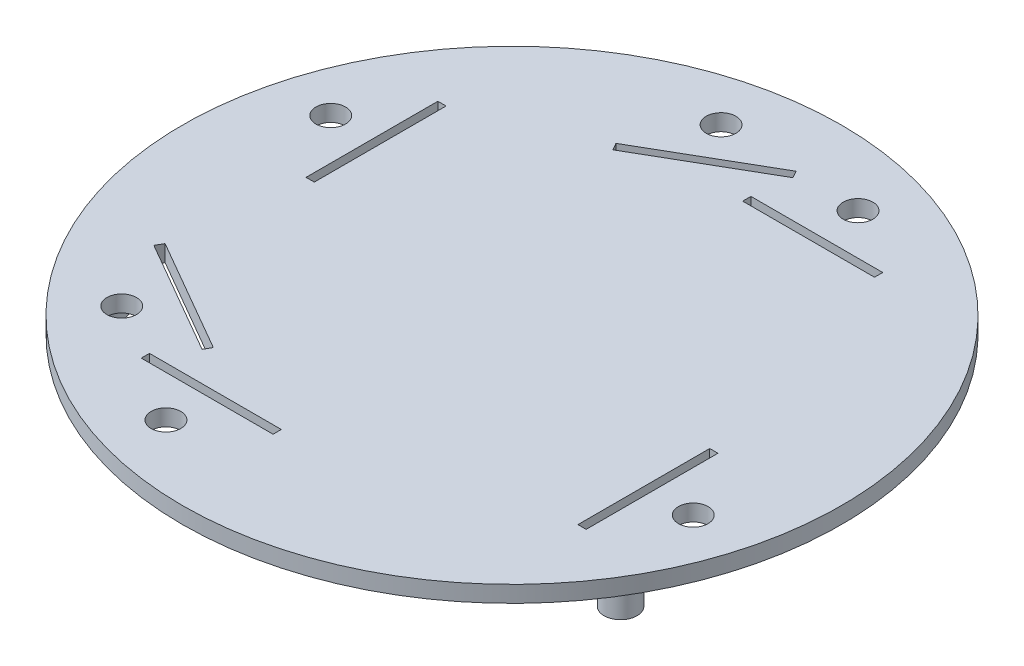
ISO-10303-21;
HEADER;
FILE_DESCRIPTION(('STEP AP214'),'2;1');
FILE_NAME('part.step','',(''),(''),'','','');
FILE_SCHEMA(('AUTOMOTIVE_DESIGN { 1 0 10303 214 1 1 1 1 }'));
ENDSEC;
DATA;
#1=APPLICATION_CONTEXT('core data for automotive mechanical design processes');
#2=APPLICATION_PROTOCOL_DEFINITION('international standard','automotive_design',2000,#1);
#3=PRODUCT_CONTEXT('',#1,'mechanical');
#4=PRODUCT('Part','Part','',(#3));
#5=PRODUCT_RELATED_PRODUCT_CATEGORY('part','',(#4));
#6=PRODUCT_DEFINITION_FORMATION('','',#4);
#7=PRODUCT_DEFINITION_CONTEXT('part definition',#1,'design');
#8=PRODUCT_DEFINITION('design','',#6,#7);
#9=PRODUCT_DEFINITION_SHAPE('','',#8);
#10=(LENGTH_UNIT() NAMED_UNIT(*) SI_UNIT(.MILLI.,.METRE.));
#11=(NAMED_UNIT(*) PLANE_ANGLE_UNIT() SI_UNIT($,.RADIAN.));
#12=(NAMED_UNIT(*) SI_UNIT($,.STERADIAN.) SOLID_ANGLE_UNIT());
#13=UNCERTAINTY_MEASURE_WITH_UNIT(LENGTH_MEASURE(1.E-05),#10,'distance_accuracy_value','');
#14=(GEOMETRIC_REPRESENTATION_CONTEXT(3) GLOBAL_UNCERTAINTY_ASSIGNED_CONTEXT((#13)) GLOBAL_UNIT_ASSIGNED_CONTEXT((#10,
#11,#12)) REPRESENTATION_CONTEXT('',''));
#15=CARTESIAN_POINT('',(0.,0.,0.));
#16=DIRECTION('',(0.,0.,1.));
#17=DIRECTION('',(1.,0.,0.));
#18=AXIS2_PLACEMENT_3D('',#15,#16,#17);
#19=CARTESIAN_POINT('',(0.,6.35,0.));
#20=DIRECTION('',(0.,-1.,0.));
#21=DIRECTION('',(0.,0.,-1.));
#22=AXIS2_PLACEMENT_3D('',#19,#20,#21);
#23=CYLINDRICAL_SURFACE('',#22,127.);
#24=CARTESIAN_POINT('',(0.,6.35,0.));
#25=DIRECTION('',(0.,1.,0.));
#26=DIRECTION('',(0.,0.,1.));
#27=AXIS2_PLACEMENT_3D('',#24,#25,#26);
#28=CIRCLE('',#27,127.);
#29=CARTESIAN_POINT('',(0.,6.35,127.));
#30=VERTEX_POINT('',#29);
#31=EDGE_CURVE('E349',#30,#30,#28,.T.);
#32=ORIENTED_EDGE('',*,*,#31,.F.);
#33=EDGE_LOOP('',(#32));
#34=FACE_BOUND('',#33,.T.);
#35=CARTESIAN_POINT('',(0.,0.,0.));
#36=DIRECTION('',(0.,1.,0.));
#37=DIRECTION('',(0.,0.,1.));
#38=AXIS2_PLACEMENT_3D('',#35,#36,#37);
#39=CIRCLE('',#38,127.);
#40=CARTESIAN_POINT('',(0.,0.,127.));
#41=VERTEX_POINT('',#40);
#42=EDGE_CURVE('E348',#41,#41,#39,.T.);
#43=ORIENTED_EDGE('',*,*,#42,.T.);
#44=EDGE_LOOP('',(#43));
#45=FACE_BOUND('',#44,.T.);
#46=ADVANCED_FACE('F35',(#34,#45),#23,.T.);
#47=CARTESIAN_POINT('',(0.,6.35,0.));
#48=DIRECTION('',(0.,1.,0.));
#49=DIRECTION('',(0.,0.,1.));
#50=AXIS2_PLACEMENT_3D('',#47,#48,#49);
#51=PLANE('',#50);
#52=CARTESIAN_POINT('',(-31.75,6.35,101.6));
#53=DIRECTION('',(0.,1.,0.));
#54=DIRECTION('',(0.,0.,1.));
#55=AXIS2_PLACEMENT_3D('',#52,#53,#54);
#56=CIRCLE('',#55,5.71499999999998);
#57=CARTESIAN_POINT('',(-31.75,6.35,107.315));
#58=VERTEX_POINT('',#57);
#59=EDGE_CURVE('E237',#58,#58,#56,.T.);
#60=ORIENTED_EDGE('',*,*,#59,.F.);
#61=EDGE_LOOP('',(#60));
#62=FACE_BOUND('',#61,.T.);
#63=CARTESIAN_POINT('',(-78.2963065701559,6.35,72.113181024499));
#64=DIRECTION('',(0.,1.,0.));
#65=DIRECTION('',(0.,0.,1.));
#66=AXIS2_PLACEMENT_3D('',#63,#64,#65);
#67=CIRCLE('',#66,5.71499999999998);
#68=CARTESIAN_POINT('',(-78.2963065701559,6.35,77.828181024499));
#69=VERTEX_POINT('',#68);
#70=EDGE_CURVE('E234',#69,#69,#67,.T.);
#71=ORIENTED_EDGE('',*,*,#70,.F.);
#72=EDGE_LOOP('',(#71));
#73=FACE_BOUND('',#72,.T.);
#74=CARTESIAN_POINT('',(101.6,6.35,31.75));
#75=DIRECTION('',(0.,1.,0.));
#76=DIRECTION('',(0.,0.,1.));
#77=AXIS2_PLACEMENT_3D('',#74,#75,#76);
#78=CIRCLE('',#77,5.71499999999999);
#79=CARTESIAN_POINT('',(101.6,6.35,37.465));
#80=VERTEX_POINT('',#79);
#81=EDGE_CURVE('E231',#80,#80,#78,.T.);
#82=ORIENTED_EDGE('',*,*,#81,.F.);
#83=EDGE_LOOP('',(#82));
#84=FACE_BOUND('',#83,.T.);
#85=DIRECTION('',(0.500000000000001,0.,0.866025403784438));
#86=VECTOR('',#85,1.);
#87=CARTESIAN_POINT('',(-35.7757386859689,6.35,-74.6653970824054));
#88=LINE('',#87,#86);
#89=CARTESIAN_POINT('',(-37.3632386859688,6.35,-77.415027739421));
#90=VERTEX_POINT('',#89);
#91=CARTESIAN_POINT('',(-35.7757386859689,6.35,-74.6653970824054));
#92=VERTEX_POINT('',#91);
#93=EDGE_CURVE('E51',#90,#92,#88,.T.);
#94=ORIENTED_EDGE('',*,*,#93,.F.);
#95=DIRECTION('',(-0.866025403784438,0.,0.500000000000001));
#96=VECTOR('',#95,1.);
#97=CARTESIAN_POINT('',(-37.3632386859688,6.35,-77.415027739421));
#98=LINE('',#97,#96);
#99=CARTESIAN_POINT('',(6.63085182628063,6.35,-102.815027739421));
#100=VERTEX_POINT('',#99);
#101=EDGE_CURVE('E221',#100,#90,#98,.T.);
#102=ORIENTED_EDGE('',*,*,#101,.F.);
#103=DIRECTION('',(-0.499999999999997,0.,-0.86602540378444));
#104=VECTOR('',#103,1.);
#105=CARTESIAN_POINT('',(8.21835182628063,6.35,-100.065397082405));
#106=LINE('',#105,#104);
#107=CARTESIAN_POINT('',(8.21835182628063,6.35,-100.065397082405));
#108=VERTEX_POINT('',#107);
#109=EDGE_CURVE('E204',#108,#100,#106,.T.);
#110=ORIENTED_EDGE('',*,*,#109,.F.);
#111=DIRECTION('',(0.866025403784438,0.,-0.5));
#112=VECTOR('',#111,1.);
#113=CARTESIAN_POINT('',(-35.7757386859689,6.35,-74.6653970824054));
#114=LINE('',#113,#112);
#115=EDGE_CURVE('E214',#92,#108,#114,.T.);
#116=ORIENTED_EDGE('',*,*,#115,.F.);
#117=EDGE_LOOP('',(#94,#102,#110,#116));
#118=FACE_BOUND('',#117,.T.);
#119=DIRECTION('',(0.,0.,-1.));
#120=VECTOR('',#119,1.);
#121=CARTESIAN_POINT('',(-6.34999999999999,6.35,82.55));
#122=LINE('',#121,#120);
#123=CARTESIAN_POINT('',(-6.34999999999999,6.35,85.725));
#124=VERTEX_POINT('',#123);
#125=CARTESIAN_POINT('',(-6.34999999999999,6.35,82.55));
#126=VERTEX_POINT('',#125);
#127=EDGE_CURVE('E59',#124,#126,#122,.T.);
#128=ORIENTED_EDGE('',*,*,#127,.F.);
#129=DIRECTION('',(1.,0.,0.));
#130=VECTOR('',#129,1.);
#131=CARTESIAN_POINT('',(-6.34999999999999,6.35,85.725));
#132=LINE('',#131,#130);
#133=CARTESIAN_POINT('',(-57.15,6.35,85.725));
#134=VERTEX_POINT('',#133);
#135=EDGE_CURVE('E289',#134,#124,#132,.T.);
#136=ORIENTED_EDGE('',*,*,#135,.F.);
#137=DIRECTION('',(0.,0.,1.));
#138=VECTOR('',#137,1.);
#139=CARTESIAN_POINT('',(-57.15,6.35,82.55));
#140=LINE('',#139,#138);
#141=CARTESIAN_POINT('',(-57.15,6.35,82.55));
#142=VERTEX_POINT('',#141);
#143=EDGE_CURVE('E286',#142,#134,#140,.T.);
#144=ORIENTED_EDGE('',*,*,#143,.F.);
#145=DIRECTION('',(-1.,0.,0.));
#146=VECTOR('',#145,1.);
#147=CARTESIAN_POINT('',(-6.34999999999999,6.35,82.55));
#148=LINE('',#147,#146);
#149=EDGE_CURVE('E282',#126,#142,#148,.T.);
#150=ORIENTED_EDGE('',*,*,#149,.F.);
#151=EDGE_LOOP('',(#128,#136,#144,#150));
#152=FACE_BOUND('',#151,.T.);
#153=DIRECTION('',(1.,0.,0.));
#154=VECTOR('',#153,1.);
#155=CARTESIAN_POINT('',(-82.55,6.35,-6.34999999999999));
#156=LINE('',#155,#154);
#157=CARTESIAN_POINT('',(-85.725,6.35,-6.34999999999999));
#158=VERTEX_POINT('',#157);
#159=CARTESIAN_POINT('',(-82.55,6.35,-6.34999999999999));
#160=VERTEX_POINT('',#159);
#161=EDGE_CURVE('E256',#158,#160,#156,.T.);
#162=ORIENTED_EDGE('',*,*,#161,.F.);
#163=DIRECTION('',(0.,0.,1.));
#164=VECTOR('',#163,1.);
#165=CARTESIAN_POINT('',(-85.725,6.35,-6.34999999999999));
#166=LINE('',#165,#164);
#167=CARTESIAN_POINT('',(-85.725,6.35,-57.15));
#168=VERTEX_POINT('',#167);
#169=EDGE_CURVE('E308',#168,#158,#166,.T.);
#170=ORIENTED_EDGE('',*,*,#169,.F.);
#171=DIRECTION('',(-1.,0.,0.));
#172=VECTOR('',#171,1.);
#173=CARTESIAN_POINT('',(-82.55,6.35,-57.15));
#174=LINE('',#173,#172);
#175=CARTESIAN_POINT('',(-82.55,6.35,-57.15));
#176=VERTEX_POINT('',#175);
#177=EDGE_CURVE('E305',#176,#168,#174,.T.);
#178=ORIENTED_EDGE('',*,*,#177,.F.);
#179=DIRECTION('',(0.,0.,-1.));
#180=VECTOR('',#179,1.);
#181=CARTESIAN_POINT('',(-82.55,6.35,-6.34999999999999));
#182=LINE('',#181,#180);
#183=EDGE_CURVE('E302',#160,#176,#182,.T.);
#184=ORIENTED_EDGE('',*,*,#183,.F.);
#185=EDGE_LOOP('',(#162,#170,#178,#184));
#186=FACE_BOUND('',#185,.T.);
#187=DIRECTION('',(0.,0.,1.));
#188=VECTOR('',#187,1.);
#189=CARTESIAN_POINT('',(6.34999999999998,6.35,-82.55));
#190=LINE('',#189,#188);
#191=CARTESIAN_POINT('',(6.34999999999998,6.35,-85.725));
#192=VERTEX_POINT('',#191);
#193=CARTESIAN_POINT('',(6.34999999999998,6.35,-82.55));
#194=VERTEX_POINT('',#193);
#195=EDGE_CURVE('E241',#192,#194,#190,.T.);
#196=ORIENTED_EDGE('',*,*,#195,.F.);
#197=DIRECTION('',(-1.,0.,0.));
#198=VECTOR('',#197,1.);
#199=CARTESIAN_POINT('',(6.34999999999998,6.35,-85.725));
#200=LINE('',#199,#198);
#201=CARTESIAN_POINT('',(57.15,6.35,-85.725));
#202=VERTEX_POINT('',#201);
#203=EDGE_CURVE('E250',#202,#192,#200,.T.);
#204=ORIENTED_EDGE('',*,*,#203,.F.);
#205=DIRECTION('',(0.,0.,-1.));
#206=VECTOR('',#205,1.);
#207=CARTESIAN_POINT('',(57.15,6.35,-82.55));
#208=LINE('',#207,#206);
#209=CARTESIAN_POINT('',(57.15,6.35,-82.55));
#210=VERTEX_POINT('',#209);
#211=EDGE_CURVE('E247',#210,#202,#208,.T.);
#212=ORIENTED_EDGE('',*,*,#211,.F.);
#213=DIRECTION('',(1.,0.,0.));
#214=VECTOR('',#213,1.);
#215=CARTESIAN_POINT('',(6.34999999999998,6.35,-82.55));
#216=LINE('',#215,#214);
#217=EDGE_CURVE('E243',#194,#210,#216,.T.);
#218=ORIENTED_EDGE('',*,*,#217,.F.);
#219=EDGE_LOOP('',(#196,#204,#212,#218));
#220=FACE_BOUND('',#219,.T.);
#221=DIRECTION('',(0.500000000000001,0.,-0.866025403784438));
#222=VECTOR('',#221,1.);
#223=CARTESIAN_POINT('',(-46.7742613140312,6.35,68.3153970824054));
#224=LINE('',#223,#222);
#225=CARTESIAN_POINT('',(-48.3617613140312,6.35,71.065027739421));
#226=VERTEX_POINT('',#225);
#227=CARTESIAN_POINT('',(-46.7742613140312,6.35,68.3153970824054));
#228=VERTEX_POINT('',#227);
#229=EDGE_CURVE('E228',#226,#228,#224,.T.);
#230=ORIENTED_EDGE('',*,*,#229,.F.);
#231=DIRECTION('',(0.866025403784439,0.,0.5));
#232=VECTOR('',#231,1.);
#233=CARTESIAN_POINT('',(-48.3617613140312,6.35,71.065027739421));
#234=LINE('',#233,#232);
#235=CARTESIAN_POINT('',(-92.3558518262807,6.35,45.665027739421));
#236=VERTEX_POINT('',#235);
#237=EDGE_CURVE('E270',#236,#226,#234,.T.);
#238=ORIENTED_EDGE('',*,*,#237,.F.);
#239=DIRECTION('',(-0.500000000000002,0.,0.866025403784437));
#240=VECTOR('',#239,1.);
#241=CARTESIAN_POINT('',(-90.7683518262807,6.35,42.9153970824054));
#242=LINE('',#241,#240);
#243=CARTESIAN_POINT('',(-90.7683518262807,6.35,42.9153970824054));
#244=VERTEX_POINT('',#243);
#245=EDGE_CURVE('E267',#244,#236,#242,.T.);
#246=ORIENTED_EDGE('',*,*,#245,.F.);
#247=DIRECTION('',(-0.866025403784439,0.,-0.5));
#248=VECTOR('',#247,1.);
#249=CARTESIAN_POINT('',(-46.7742613140312,6.35,68.3153970824054));
#250=LINE('',#249,#248);
#251=EDGE_CURVE('E264',#228,#244,#250,.T.);
#252=ORIENTED_EDGE('',*,*,#251,.F.);
#253=EDGE_LOOP('',(#230,#238,#246,#252));
#254=FACE_BOUND('',#253,.T.);
#255=CARTESIAN_POINT('',(-23.3036934298441,6.35,-103.863181024499));
#256=DIRECTION('',(0.,1.,0.));
#257=DIRECTION('',(0.,0.,1.));
#258=AXIS2_PLACEMENT_3D('',#255,#256,#257);
#259=CIRCLE('',#258,5.715);
#260=CARTESIAN_POINT('',(-23.3036934298441,6.35,-98.148181024499));
#261=VERTEX_POINT('',#260);
#262=EDGE_CURVE('E672',#261,#261,#259,.T.);
#263=ORIENTED_EDGE('',*,*,#262,.F.);
#264=EDGE_LOOP('',(#263));
#265=FACE_BOUND('',#264,.T.);
#266=CARTESIAN_POINT('',(31.75,6.35,-101.6));
#267=DIRECTION('',(0.,1.,0.));
#268=DIRECTION('',(0.,0.,1.));
#269=AXIS2_PLACEMENT_3D('',#266,#267,#268);
#270=CIRCLE('',#269,5.71499999999999);
#271=CARTESIAN_POINT('',(31.75,6.35,-95.885));
#272=VERTEX_POINT('',#271);
#273=EDGE_CURVE('E669',#272,#272,#270,.T.);
#274=ORIENTED_EDGE('',*,*,#273,.F.);
#275=EDGE_LOOP('',(#274));
#276=FACE_BOUND('',#275,.T.);
#277=CARTESIAN_POINT('',(-101.6,6.35,-31.75));
#278=DIRECTION('',(0.,1.,0.));
#279=DIRECTION('',(0.,0.,1.));
#280=AXIS2_PLACEMENT_3D('',#277,#278,#279);
#281=CIRCLE('',#280,5.71499999999999);
#282=CARTESIAN_POINT('',(-101.6,6.35,-26.035));
#283=VERTEX_POINT('',#282);
#284=EDGE_CURVE('E240',#283,#283,#281,.T.);
#285=ORIENTED_EDGE('',*,*,#284,.F.);
#286=EDGE_LOOP('',(#285));
#287=FACE_BOUND('',#286,.T.);
#288=DIRECTION('',(0.,0.,1.));
#289=VECTOR('',#288,1.);
#290=CARTESIAN_POINT('',(82.55,6.35,6.35));
#291=LINE('',#290,#289);
#292=CARTESIAN_POINT('',(82.55,6.35,6.35));
#293=VERTEX_POINT('',#292);
#294=CARTESIAN_POINT('',(82.55,6.35,57.15));
#295=VERTEX_POINT('',#294);
#296=EDGE_CURVE('E295',#293,#295,#291,.T.);
#297=ORIENTED_EDGE('',*,*,#296,.F.);
#298=DIRECTION('',(-1.,0.,0.));
#299=VECTOR('',#298,1.);
#300=CARTESIAN_POINT('',(82.55,6.35,6.35));
#301=LINE('',#300,#299);
#302=CARTESIAN_POINT('',(85.725,6.35,6.35));
#303=VERTEX_POINT('',#302);
#304=EDGE_CURVE('E326',#303,#293,#301,.T.);
#305=ORIENTED_EDGE('',*,*,#304,.F.);
#306=DIRECTION('',(0.,0.,-1.));
#307=VECTOR('',#306,1.);
#308=CARTESIAN_POINT('',(85.725,6.35,6.35));
#309=LINE('',#308,#307);
#310=CARTESIAN_POINT('',(85.725,6.35,57.15));
#311=VERTEX_POINT('',#310);
#312=EDGE_CURVE('E323',#311,#303,#309,.T.);
#313=ORIENTED_EDGE('',*,*,#312,.F.);
#314=DIRECTION('',(1.,0.,0.));
#315=VECTOR('',#314,1.);
#316=CARTESIAN_POINT('',(82.55,6.35,57.15));
#317=LINE('',#316,#315);
#318=EDGE_CURVE('E320',#295,#311,#317,.T.);
#319=ORIENTED_EDGE('',*,*,#318,.F.);
#320=EDGE_LOOP('',(#297,#305,#313,#319));
#321=FACE_BOUND('',#320,.T.);
#322=ORIENTED_EDGE('',*,*,#31,.T.);
#323=EDGE_LOOP('',(#322));
#324=FACE_BOUND('',#323,.T.);
#325=ADVANCED_FACE('F218',(#62,#73,#84,#118,#152,#186,#220,#254,#265,#276,#287,#321,#324),#51,.T.);
#326=CARTESIAN_POINT('',(0.,0.,0.));
#327=DIRECTION('',(0.,1.,0.));
#328=DIRECTION('',(0.,0.,1.));
#329=AXIS2_PLACEMENT_3D('',#326,#327,#328);
#330=PLANE('',#329);
#331=CARTESIAN_POINT('',(-31.75,0.,101.6));
#332=DIRECTION('',(0.,1.,0.));
#333=DIRECTION('',(0.,0.,1.));
#334=AXIS2_PLACEMENT_3D('',#331,#332,#333);
#335=CIRCLE('',#334,5.71499999999998);
#336=CARTESIAN_POINT('',(-31.75,0.,107.315));
#337=VERTEX_POINT('',#336);
#338=EDGE_CURVE('E38',#337,#337,#335,.T.);
#339=ORIENTED_EDGE('',*,*,#338,.T.);
#340=EDGE_LOOP('',(#339));
#341=FACE_BOUND('',#340,.T.);
#342=CARTESIAN_POINT('',(-78.2963065701559,0.,72.113181024499));
#343=DIRECTION('',(0.,1.,0.));
#344=DIRECTION('',(0.,0.,1.));
#345=AXIS2_PLACEMENT_3D('',#342,#343,#344);
#346=CIRCLE('',#345,5.71499999999998);
#347=CARTESIAN_POINT('',(-78.2963065701559,0.,77.828181024499));
#348=VERTEX_POINT('',#347);
#349=EDGE_CURVE('E438',#348,#348,#346,.T.);
#350=ORIENTED_EDGE('',*,*,#349,.T.);
#351=EDGE_LOOP('',(#350));
#352=FACE_BOUND('',#351,.T.);
#353=CARTESIAN_POINT('',(101.6,0.,31.75));
#354=DIRECTION('',(0.,1.,0.));
#355=DIRECTION('',(0.,0.,1.));
#356=AXIS2_PLACEMENT_3D('',#353,#354,#355);
#357=CIRCLE('',#356,5.71499999999999);
#358=CARTESIAN_POINT('',(101.6,0.,37.465));
#359=VERTEX_POINT('',#358);
#360=EDGE_CURVE('E384',#359,#359,#357,.T.);
#361=ORIENTED_EDGE('',*,*,#360,.T.);
#362=EDGE_LOOP('',(#361));
#363=FACE_BOUND('',#362,.T.);
#364=DIRECTION('',(-0.866025403784438,0.,0.500000000000001));
#365=VECTOR('',#364,1.);
#366=CARTESIAN_POINT('',(-42.8625000000001,0.,-74.2400277394209));
#367=LINE('',#366,#365);
#368=CARTESIAN_POINT('',(6.63085182628063,0.,-102.815027739421));
#369=VERTEX_POINT('',#368);
#370=CARTESIAN_POINT('',(-37.3632386859688,0.,-77.415027739421));
#371=VERTEX_POINT('',#370);
#372=EDGE_CURVE('E43',#369,#371,#367,.T.);
#373=ORIENTED_EDGE('',*,*,#372,.T.);
#374=DIRECTION('',(0.500000000000001,0.,0.866025403784438));
#375=VECTOR('',#374,1.);
#376=CARTESIAN_POINT('',(5.49926131403124,0.,-3.17500000000004));
#377=LINE('',#376,#375);
#378=CARTESIAN_POINT('',(-35.7757386859689,0.,-74.6653970824054));
#379=VERTEX_POINT('',#378);
#380=EDGE_CURVE('E11',#371,#379,#377,.T.);
#381=ORIENTED_EDGE('',*,*,#380,.T.);
#382=DIRECTION('',(0.866025403784438,0.,-0.5));
#383=VECTOR('',#382,1.);
#384=CARTESIAN_POINT('',(-41.275,0.,-71.4903970824054));
#385=LINE('',#384,#383);
#386=CARTESIAN_POINT('',(8.21835182628063,0.,-100.065397082405));
#387=VERTEX_POINT('',#386);
#388=EDGE_CURVE('E432',#379,#387,#385,.T.);
#389=ORIENTED_EDGE('',*,*,#388,.T.);
#390=DIRECTION('',(-0.499999999999997,0.,-0.86602540378444));
#391=VECTOR('',#390,1.);
#392=CARTESIAN_POINT('',(49.4933518262805,0.,-28.5749999999997));
#393=LINE('',#392,#391);
#394=EDGE_CURVE('E207',#387,#369,#393,.T.);
#395=ORIENTED_EDGE('',*,*,#394,.T.);
#396=EDGE_LOOP('',(#373,#381,#389,#395));
#397=FACE_BOUND('',#396,.T.);
#398=DIRECTION('',(1.,0.,0.));
#399=VECTOR('',#398,1.);
#400=CARTESIAN_POINT('',(0.,0.,85.725));
#401=LINE('',#400,#399);
#402=CARTESIAN_POINT('',(-57.15,0.,85.725));
#403=VERTEX_POINT('',#402);
#404=CARTESIAN_POINT('',(-6.34999999999999,0.,85.725));
#405=VERTEX_POINT('',#404);
#406=EDGE_CURVE('E426',#403,#405,#401,.T.);
#407=ORIENTED_EDGE('',*,*,#406,.T.);
#408=DIRECTION('',(0.,0.,-1.));
#409=VECTOR('',#408,1.);
#410=CARTESIAN_POINT('',(-6.34999999999999,0.,0.));
#411=LINE('',#410,#409);
#412=CARTESIAN_POINT('',(-6.34999999999999,0.,82.55));
#413=VERTEX_POINT('',#412);
#414=EDGE_CURVE('E429',#405,#413,#411,.T.);
#415=ORIENTED_EDGE('',*,*,#414,.T.);
#416=DIRECTION('',(-1.,0.,0.));
#417=VECTOR('',#416,1.);
#418=CARTESIAN_POINT('',(0.,0.,82.55));
#419=LINE('',#418,#417);
#420=CARTESIAN_POINT('',(-57.15,0.,82.55));
#421=VERTEX_POINT('',#420);
#422=EDGE_CURVE('E420',#413,#421,#419,.T.);
#423=ORIENTED_EDGE('',*,*,#422,.T.);
#424=DIRECTION('',(0.,0.,1.));
#425=VECTOR('',#424,1.);
#426=CARTESIAN_POINT('',(-57.1499999999998,0.,-1.2490009027033E-13));
#427=LINE('',#426,#425);
#428=EDGE_CURVE('E423',#421,#403,#427,.T.);
#429=ORIENTED_EDGE('',*,*,#428,.T.);
#430=EDGE_LOOP('',(#407,#415,#423,#429));
#431=FACE_BOUND('',#430,.T.);
#432=DIRECTION('',(0.,0.,1.));
#433=VECTOR('',#432,1.);
#434=CARTESIAN_POINT('',(-85.725,0.,0.));
#435=LINE('',#434,#433);
#436=CARTESIAN_POINT('',(-85.725,0.,-57.15));
#437=VERTEX_POINT('',#436);
#438=CARTESIAN_POINT('',(-85.725,0.,-6.34999999999999));
#439=VERTEX_POINT('',#438);
#440=EDGE_CURVE('E414',#437,#439,#435,.T.);
#441=ORIENTED_EDGE('',*,*,#440,.T.);
#442=DIRECTION('',(1.,0.,0.));
#443=VECTOR('',#442,1.);
#444=CARTESIAN_POINT('',(0.,0.,-6.34999999999999));
#445=LINE('',#444,#443);
#446=CARTESIAN_POINT('',(-82.55,0.,-6.34999999999999));
#447=VERTEX_POINT('',#446);
#448=EDGE_CURVE('E417',#439,#447,#445,.T.);
#449=ORIENTED_EDGE('',*,*,#448,.T.);
#450=DIRECTION('',(0.,0.,-1.));
#451=VECTOR('',#450,1.);
#452=CARTESIAN_POINT('',(-82.55,0.,0.));
#453=LINE('',#452,#451);
#454=CARTESIAN_POINT('',(-82.55,0.,-57.15));
#455=VERTEX_POINT('',#454);
#456=EDGE_CURVE('E408',#447,#455,#453,.T.);
#457=ORIENTED_EDGE('',*,*,#456,.T.);
#458=DIRECTION('',(-1.,0.,0.));
#459=VECTOR('',#458,1.);
#460=CARTESIAN_POINT('',(0.,0.,-57.15));
#461=LINE('',#460,#459);
#462=EDGE_CURVE('E411',#455,#437,#461,.T.);
#463=ORIENTED_EDGE('',*,*,#462,.T.);
#464=EDGE_LOOP('',(#441,#449,#457,#463));
#465=FACE_BOUND('',#464,.T.);
#466=DIRECTION('',(-1.,0.,0.));
#467=VECTOR('',#466,1.);
#468=CARTESIAN_POINT('',(0.,0.,-85.725));
#469=LINE('',#468,#467);
#470=CARTESIAN_POINT('',(57.15,0.,-85.725));
#471=VERTEX_POINT('',#470);
#472=CARTESIAN_POINT('',(6.34999999999998,0.,-85.725));
#473=VERTEX_POINT('',#472);
#474=EDGE_CURVE('E402',#471,#473,#469,.T.);
#475=ORIENTED_EDGE('',*,*,#474,.T.);
#476=DIRECTION('',(0.,0.,1.));
#477=VECTOR('',#476,1.);
#478=CARTESIAN_POINT('',(6.34999999999998,0.,0.));
#479=LINE('',#478,#477);
#480=CARTESIAN_POINT('',(6.34999999999998,0.,-82.55));
#481=VERTEX_POINT('',#480);
#482=EDGE_CURVE('E405',#473,#481,#479,.T.);
#483=ORIENTED_EDGE('',*,*,#482,.T.);
#484=DIRECTION('',(1.,0.,0.));
#485=VECTOR('',#484,1.);
#486=CARTESIAN_POINT('',(0.,0.,-82.55));
#487=LINE('',#486,#485);
#488=CARTESIAN_POINT('',(57.15,0.,-82.55));
#489=VERTEX_POINT('',#488);
#490=EDGE_CURVE('E396',#481,#489,#487,.T.);
#491=ORIENTED_EDGE('',*,*,#490,.T.);
#492=DIRECTION('',(0.,0.,-1.));
#493=VECTOR('',#492,1.);
#494=CARTESIAN_POINT('',(57.1499999999998,0.,1.2490009027033E-13));
#495=LINE('',#494,#493);
#496=EDGE_CURVE('E399',#489,#471,#495,.T.);
#497=ORIENTED_EDGE('',*,*,#496,.T.);
#498=EDGE_LOOP('',(#475,#483,#491,#497));
#499=FACE_BOUND('',#498,.T.);
#500=DIRECTION('',(0.866025403784439,0.,0.5));
#501=VECTOR('',#500,1.);
#502=CARTESIAN_POINT('',(-42.8625,0.,74.240027739421));
#503=LINE('',#502,#501);
#504=CARTESIAN_POINT('',(-92.3558518262807,0.,45.665027739421));
#505=VERTEX_POINT('',#504);
#506=CARTESIAN_POINT('',(-48.3617613140312,0.,71.065027739421));
#507=VERTEX_POINT('',#506);
#508=EDGE_CURVE('E390',#505,#507,#503,.T.);
#509=ORIENTED_EDGE('',*,*,#508,.T.);
#510=DIRECTION('',(0.500000000000001,0.,-0.866025403784438));
#511=VECTOR('',#510,1.);
#512=CARTESIAN_POINT('',(-5.49926131403107,0.,-3.17499999999994));
#513=LINE('',#512,#511);
#514=CARTESIAN_POINT('',(-46.7742613140312,0.,68.3153970824054));
#515=VERTEX_POINT('',#514);
#516=EDGE_CURVE('E393',#507,#515,#513,.T.);
#517=ORIENTED_EDGE('',*,*,#516,.T.);
#518=DIRECTION('',(-0.866025403784439,0.,-0.5));
#519=VECTOR('',#518,1.);
#520=CARTESIAN_POINT('',(-41.275,0.,71.4903970824054));
#521=LINE('',#520,#519);
#522=CARTESIAN_POINT('',(-90.7683518262807,0.,42.9153970824054));
#523=VERTEX_POINT('',#522);
#524=EDGE_CURVE('E375',#515,#523,#521,.T.);
#525=ORIENTED_EDGE('',*,*,#524,.T.);
#526=DIRECTION('',(-0.500000000000003,0.,0.866025403784437));
#527=VECTOR('',#526,1.);
#528=CARTESIAN_POINT('',(-49.4933518262804,0.,-28.575));
#529=LINE('',#528,#527);
#530=EDGE_CURVE('E387',#523,#505,#529,.T.);
#531=ORIENTED_EDGE('',*,*,#530,.T.);
#532=EDGE_LOOP('',(#509,#517,#525,#531));
#533=FACE_BOUND('',#532,.T.);
#534=CARTESIAN_POINT('',(-23.3036934298441,0.,-103.863181024499));
#535=DIRECTION('',(0.,1.,0.));
#536=DIRECTION('',(0.,0.,1.));
#537=AXIS2_PLACEMENT_3D('',#534,#535,#536);
#538=CIRCLE('',#537,5.715);
#539=CARTESIAN_POINT('',(-23.3036934298441,0.,-98.148181024499));
#540=VERTEX_POINT('',#539);
#541=EDGE_CURVE('E381',#540,#540,#538,.T.);
#542=ORIENTED_EDGE('',*,*,#541,.T.);
#543=EDGE_LOOP('',(#542));
#544=FACE_BOUND('',#543,.T.);
#545=CARTESIAN_POINT('',(31.75,0.,-101.6));
#546=DIRECTION('',(0.,1.,0.));
#547=DIRECTION('',(0.,0.,1.));
#548=AXIS2_PLACEMENT_3D('',#545,#546,#547);
#549=CIRCLE('',#548,5.71499999999999);
#550=CARTESIAN_POINT('',(31.75,0.,-95.885));
#551=VERTEX_POINT('',#550);
#552=EDGE_CURVE('E378',#551,#551,#549,.T.);
#553=ORIENTED_EDGE('',*,*,#552,.T.);
#554=EDGE_LOOP('',(#553));
#555=FACE_BOUND('',#554,.T.);
#556=CARTESIAN_POINT('',(-101.6,0.,-31.75));
#557=DIRECTION('',(0.,1.,0.));
#558=DIRECTION('',(0.,0.,1.));
#559=AXIS2_PLACEMENT_3D('',#556,#557,#558);
#560=CIRCLE('',#559,5.71499999999999);
#561=CARTESIAN_POINT('',(-101.6,0.,-26.035));
#562=VERTEX_POINT('',#561);
#563=EDGE_CURVE('E332',#562,#562,#560,.T.);
#564=ORIENTED_EDGE('',*,*,#563,.T.);
#565=EDGE_LOOP('',(#564));
#566=FACE_BOUND('',#565,.T.);
#567=DIRECTION('',(-1.,0.,0.));
#568=VECTOR('',#567,1.);
#569=CARTESIAN_POINT('',(0.,0.,6.35));
#570=LINE('',#569,#568);
#571=CARTESIAN_POINT('',(85.725,0.,6.35));
#572=VERTEX_POINT('',#571);
#573=CARTESIAN_POINT('',(82.55,0.,6.35));
#574=VERTEX_POINT('',#573);
#575=EDGE_CURVE('E369',#572,#574,#570,.T.);
#576=ORIENTED_EDGE('',*,*,#575,.T.);
#577=DIRECTION('',(0.,0.,1.));
#578=VECTOR('',#577,1.);
#579=CARTESIAN_POINT('',(82.55,0.,0.));
#580=LINE('',#579,#578);
#581=CARTESIAN_POINT('',(82.55,0.,57.15));
#582=VERTEX_POINT('',#581);
#583=EDGE_CURVE('E372',#574,#582,#580,.T.);
#584=ORIENTED_EDGE('',*,*,#583,.T.);
#585=DIRECTION('',(1.,0.,0.));
#586=VECTOR('',#585,1.);
#587=CARTESIAN_POINT('',(-1.2490009027033E-13,0.,57.1499999999998));
#588=LINE('',#587,#586);
#589=CARTESIAN_POINT('',(85.725,0.,57.15));
#590=VERTEX_POINT('',#589);
#591=EDGE_CURVE('E363',#582,#590,#588,.T.);
#592=ORIENTED_EDGE('',*,*,#591,.T.);
#593=DIRECTION('',(0.,0.,-1.));
#594=VECTOR('',#593,1.);
#595=CARTESIAN_POINT('',(85.725,0.,0.));
#596=LINE('',#595,#594);
#597=EDGE_CURVE('E366',#590,#572,#596,.T.);
#598=ORIENTED_EDGE('',*,*,#597,.T.);
#599=EDGE_LOOP('',(#576,#584,#592,#598));
#600=FACE_BOUND('',#599,.T.);
#601=CARTESIAN_POINT('',(98.9867036525613,0.,57.1500000000001));
#602=DIRECTION('',(0.,1.,0.));
#603=DIRECTION('',(0.,0.,1.));
#604=AXIS2_PLACEMENT_3D('',#601,#602,#603);
#605=CIRCLE('',#604,6.35);
#606=CARTESIAN_POINT('',(98.9867036525613,0.,63.5000000000001));
#607=VERTEX_POINT('',#606);
#608=EDGE_CURVE('E360',#607,#607,#605,.F.);
#609=ORIENTED_EDGE('',*,*,#608,.F.);
#610=EDGE_LOOP('',(#609));
#611=FACE_BOUND('',#610,.T.);
#612=CARTESIAN_POINT('',(-98.9867036525614,0.,57.15));
#613=DIRECTION('',(0.,1.,0.));
#614=DIRECTION('',(0.,0.,1.));
#615=AXIS2_PLACEMENT_3D('',#612,#613,#614);
#616=CIRCLE('',#615,6.35);
#617=CARTESIAN_POINT('',(-98.9867036525614,0.,63.5));
#618=VERTEX_POINT('',#617);
#619=EDGE_CURVE('E357',#618,#618,#616,.F.);
#620=ORIENTED_EDGE('',*,*,#619,.F.);
#621=EDGE_LOOP('',(#620));
#622=FACE_BOUND('',#621,.T.);
#623=CARTESIAN_POINT('',(0.,0.,-114.3));
#624=DIRECTION('',(0.,1.,0.));
#625=DIRECTION('',(0.,0.,1.));
#626=AXIS2_PLACEMENT_3D('',#623,#624,#625);
#627=CIRCLE('',#626,6.35);
#628=CARTESIAN_POINT('',(0.,0.,-107.95));
#629=VERTEX_POINT('',#628);
#630=EDGE_CURVE('E352',#629,#629,#627,.F.);
#631=ORIENTED_EDGE('',*,*,#630,.F.);
#632=EDGE_LOOP('',(#631));
#633=FACE_BOUND('',#632,.T.);
#634=ORIENTED_EDGE('',*,*,#42,.F.);
#635=EDGE_LOOP('',(#634));
#636=FACE_BOUND('',#635,.T.);
#637=ADVANCED_FACE('F445',(#341,#352,#363,#397,#431,#465,#499,#533,#544,#555,#566,#600,#611,
#622,#633,#636),#330,.F.);
#638=CARTESIAN_POINT('',(0.,-12.7,-114.3));
#639=DIRECTION('',(0.,1.,0.));
#640=DIRECTION('',(0.,0.,1.));
#641=AXIS2_PLACEMENT_3D('',#638,#639,#640);
#642=CYLINDRICAL_SURFACE('',#641,6.35);
#643=CARTESIAN_POINT('',(0.,-12.7,-114.3));
#644=DIRECTION('',(0.,-1.,0.));
#645=DIRECTION('',(0.,0.,-1.));
#646=AXIS2_PLACEMENT_3D('',#643,#644,#645);
#647=CIRCLE('',#646,6.35);
#648=CARTESIAN_POINT('',(0.,-12.7,-120.65));
#649=VERTEX_POINT('',#648);
#650=EDGE_CURVE('E345',#649,#649,#647,.T.);
#651=ORIENTED_EDGE('',*,*,#650,.F.);
#652=EDGE_LOOP('',(#651));
#653=FACE_BOUND('',#652,.T.);
#654=ORIENTED_EDGE('',*,*,#630,.T.);
#655=EDGE_LOOP('',(#654));
#656=FACE_BOUND('',#655,.T.);
#657=ADVANCED_FACE('F471',(#653,#656),#642,.T.);
#658=CARTESIAN_POINT('',(0.,-12.7,-114.3));
#659=DIRECTION('',(0.,-1.,0.));
#660=DIRECTION('',(0.,0.,-1.));
#661=AXIS2_PLACEMENT_3D('',#658,#659,#660);
#662=PLANE('',#661);
#663=ORIENTED_EDGE('',*,*,#650,.T.);
#664=EDGE_LOOP('',(#663));
#665=FACE_BOUND('',#664,.T.);
#666=ADVANCED_FACE('F475',(#665),#662,.T.);
#667=CARTESIAN_POINT('',(-98.9867036525614,-12.7,57.15));
#668=DIRECTION('',(0.,1.,0.));
#669=DIRECTION('',(0.,0.,1.));
#670=AXIS2_PLACEMENT_3D('',#667,#668,#669);
#671=CYLINDRICAL_SURFACE('',#670,6.35);
#672=CARTESIAN_POINT('',(-98.9867036525614,-12.7,57.15));
#673=DIRECTION('',(0.,-1.,0.));
#674=DIRECTION('',(0.,0.,-1.));
#675=AXIS2_PLACEMENT_3D('',#672,#673,#674);
#676=CIRCLE('',#675,6.35);
#677=CARTESIAN_POINT('',(-98.9867036525614,-12.7,50.8));
#678=VERTEX_POINT('',#677);
#679=EDGE_CURVE('E342',#678,#678,#676,.T.);
#680=ORIENTED_EDGE('',*,*,#679,.F.);
#681=EDGE_LOOP('',(#680));
#682=FACE_BOUND('',#681,.T.);
#683=ORIENTED_EDGE('',*,*,#619,.T.);
#684=EDGE_LOOP('',(#683));
#685=FACE_BOUND('',#684,.T.);
#686=ADVANCED_FACE('F481',(#682,#685),#671,.T.);
#687=CARTESIAN_POINT('',(-98.9867036525614,-12.7,57.15));
#688=DIRECTION('',(0.,-1.,0.));
#689=DIRECTION('',(0.,0.,-1.));
#690=AXIS2_PLACEMENT_3D('',#687,#688,#689);
#691=PLANE('',#690);
#692=ORIENTED_EDGE('',*,*,#679,.T.);
#693=EDGE_LOOP('',(#692));
#694=FACE_BOUND('',#693,.T.);
#695=ADVANCED_FACE('F485',(#694),#691,.T.);
#696=CARTESIAN_POINT('',(98.9867036525613,-12.7,57.1500000000001));
#697=DIRECTION('',(0.,1.,0.));
#698=DIRECTION('',(0.,0.,1.));
#699=AXIS2_PLACEMENT_3D('',#696,#697,#698);
#700=CYLINDRICAL_SURFACE('',#699,6.35);
#701=CARTESIAN_POINT('',(98.9867036525613,-12.7,57.1500000000001));
#702=DIRECTION('',(0.,-1.,0.));
#703=DIRECTION('',(0.,0.,-1.));
#704=AXIS2_PLACEMENT_3D('',#701,#702,#703);
#705=CIRCLE('',#704,6.35);
#706=CARTESIAN_POINT('',(98.9867036525613,-12.7,50.8000000000001));
#707=VERTEX_POINT('',#706);
#708=EDGE_CURVE('E339',#707,#707,#705,.T.);
#709=ORIENTED_EDGE('',*,*,#708,.F.);
#710=EDGE_LOOP('',(#709));
#711=FACE_BOUND('',#710,.T.);
#712=ORIENTED_EDGE('',*,*,#608,.T.);
#713=EDGE_LOOP('',(#712));
#714=FACE_BOUND('',#713,.T.);
#715=ADVANCED_FACE('F489',(#711,#714),#700,.T.);
#716=CARTESIAN_POINT('',(98.9867036525613,-12.7,57.1500000000001));
#717=DIRECTION('',(0.,-1.,0.));
#718=DIRECTION('',(0.,0.,-1.));
#719=AXIS2_PLACEMENT_3D('',#716,#717,#718);
#720=PLANE('',#719);
#721=ORIENTED_EDGE('',*,*,#708,.T.);
#722=EDGE_LOOP('',(#721));
#723=FACE_BOUND('',#722,.T.);
#724=ADVANCED_FACE('F493',(#723),#720,.T.);
#725=CARTESIAN_POINT('',(82.55,-12.7,6.35));
#726=DIRECTION('',(-1.,0.,0.));
#727=DIRECTION('',(0.,0.,1.));
#728=AXIS2_PLACEMENT_3D('',#725,#726,#727);
#729=PLANE('',#728);
#730=DIRECTION('',(0.,1.,0.));
#731=VECTOR('',#730,1.);
#732=CARTESIAN_POINT('',(82.55,-12.7,6.35));
#733=LINE('',#732,#731);
#734=EDGE_CURVE('E330',#574,#293,#733,.T.);
#735=ORIENTED_EDGE('',*,*,#734,.T.);
#736=ORIENTED_EDGE('',*,*,#296,.T.);
#737=DIRECTION('',(0.,1.,0.));
#738=VECTOR('',#737,1.);
#739=CARTESIAN_POINT('',(82.55,-12.7,57.15));
#740=LINE('',#739,#738);
#741=EDGE_CURVE('E329',#582,#295,#740,.T.);
#742=ORIENTED_EDGE('',*,*,#741,.F.);
#743=ORIENTED_EDGE('',*,*,#583,.F.);
#744=EDGE_LOOP('',(#735,#736,#742,#743));
#745=FACE_BOUND('',#744,.T.);
#746=ADVANCED_FACE('F497',(#745),#729,.F.);
#747=CARTESIAN_POINT('',(82.55,-12.7,6.35));
#748=DIRECTION('',(0.,0.,-1.));
#749=DIRECTION('',(-1.,0.,0.));
#750=AXIS2_PLACEMENT_3D('',#747,#748,#749);
#751=PLANE('',#750);
#752=DIRECTION('',(0.,1.,0.));
#753=VECTOR('',#752,1.);
#754=CARTESIAN_POINT('',(85.725,-12.7,6.35));
#755=LINE('',#754,#753);
#756=EDGE_CURVE('E333',#572,#303,#755,.T.);
#757=ORIENTED_EDGE('',*,*,#756,.T.);
#758=ORIENTED_EDGE('',*,*,#304,.T.);
#759=ORIENTED_EDGE('',*,*,#734,.F.);
#760=ORIENTED_EDGE('',*,*,#575,.F.);
#761=EDGE_LOOP('',(#757,#758,#759,#760));
#762=FACE_BOUND('',#761,.T.);
#763=ADVANCED_FACE('F501',(#762),#751,.F.);
#764=CARTESIAN_POINT('',(85.725,-12.7,6.35));
#765=DIRECTION('',(1.,0.,0.));
#766=DIRECTION('',(0.,0.,-1.));
#767=AXIS2_PLACEMENT_3D('',#764,#765,#766);
#768=PLANE('',#767);
#769=DIRECTION('',(0.,1.,0.));
#770=VECTOR('',#769,1.);
#771=CARTESIAN_POINT('',(85.725,-12.7,57.15));
#772=LINE('',#771,#770);
#773=EDGE_CURVE('E335',#590,#311,#772,.T.);
#774=ORIENTED_EDGE('',*,*,#773,.T.);
#775=ORIENTED_EDGE('',*,*,#312,.T.);
#776=ORIENTED_EDGE('',*,*,#756,.F.);
#777=ORIENTED_EDGE('',*,*,#597,.F.);
#778=EDGE_LOOP('',(#774,#775,#776,#777));
#779=FACE_BOUND('',#778,.T.);
#780=ADVANCED_FACE('F507',(#779),#768,.F.);
#781=CARTESIAN_POINT('',(82.55,-12.7,57.15));
#782=DIRECTION('',(0.,0.,1.));
#783=DIRECTION('',(1.,0.,0.));
#784=AXIS2_PLACEMENT_3D('',#781,#782,#783);
#785=PLANE('',#784);
#786=ORIENTED_EDGE('',*,*,#741,.T.);
#787=ORIENTED_EDGE('',*,*,#318,.T.);
#788=ORIENTED_EDGE('',*,*,#773,.F.);
#789=ORIENTED_EDGE('',*,*,#591,.F.);
#790=EDGE_LOOP('',(#786,#787,#788,#789));
#791=FACE_BOUND('',#790,.T.);
#792=ADVANCED_FACE('F503',(#791),#785,.F.);
#793=CARTESIAN_POINT('',(-101.6,-12.7,-31.75));
#794=DIRECTION('',(0.,1.,0.));
#795=DIRECTION('',(0.,0.,1.));
#796=AXIS2_PLACEMENT_3D('',#793,#794,#795);
#797=CYLINDRICAL_SURFACE('',#796,5.71499999999999);
#798=ORIENTED_EDGE('',*,*,#284,.T.);
#799=EDGE_LOOP('',(#798));
#800=FACE_BOUND('',#799,.T.);
#801=ORIENTED_EDGE('',*,*,#563,.F.);
#802=EDGE_LOOP('',(#801));
#803=FACE_BOUND('',#802,.T.);
#804=ADVANCED_FACE('F506',(#800,#803),#797,.F.);
#805=CARTESIAN_POINT('',(31.75,-12.7,-101.6));
#806=DIRECTION('',(0.,1.,0.));
#807=DIRECTION('',(0.,0.,1.));
#808=AXIS2_PLACEMENT_3D('',#805,#806,#807);
#809=CYLINDRICAL_SURFACE('',#808,5.71499999999999);
#810=ORIENTED_EDGE('',*,*,#273,.T.);
#811=EDGE_LOOP('',(#810));
#812=FACE_BOUND('',#811,.T.);
#813=ORIENTED_EDGE('',*,*,#552,.F.);
#814=EDGE_LOOP('',(#813));
#815=FACE_BOUND('',#814,.T.);
#816=ADVANCED_FACE('F620',(#812,#815),#809,.F.);
#817=CARTESIAN_POINT('',(-23.3036934298441,-12.7,-103.863181024499));
#818=DIRECTION('',(0.,1.,0.));
#819=DIRECTION('',(0.,0.,1.));
#820=AXIS2_PLACEMENT_3D('',#817,#818,#819);
#821=CYLINDRICAL_SURFACE('',#820,5.715);
#822=ORIENTED_EDGE('',*,*,#262,.T.);
#823=EDGE_LOOP('',(#822));
#824=FACE_BOUND('',#823,.T.);
#825=ORIENTED_EDGE('',*,*,#541,.F.);
#826=EDGE_LOOP('',(#825));
#827=FACE_BOUND('',#826,.T.);
#828=ADVANCED_FACE('F552',(#824,#827),#821,.F.);
#829=CARTESIAN_POINT('',(-46.7742613140312,-12.7,68.3153970824054));
#830=DIRECTION('',(0.866025403784438,0.,0.500000000000001));
#831=DIRECTION('',(0.500000000000001,0.,-0.866025403784438));
#832=AXIS2_PLACEMENT_3D('',#829,#830,#831);
#833=PLANE('',#832);
#834=DIRECTION('',(0.,1.,0.));
#835=VECTOR('',#834,1.);
#836=CARTESIAN_POINT('',(-48.3617613140312,-12.7,71.065027739421));
#837=LINE('',#836,#835);
#838=EDGE_CURVE('E244',#507,#226,#837,.T.);
#839=ORIENTED_EDGE('',*,*,#838,.T.);
#840=ORIENTED_EDGE('',*,*,#229,.T.);
#841=DIRECTION('',(0.,1.,0.));
#842=VECTOR('',#841,1.);
#843=CARTESIAN_POINT('',(-46.7742613140312,-12.7,68.3153970824054));
#844=LINE('',#843,#842);
#845=EDGE_CURVE('E273',#515,#228,#844,.T.);
#846=ORIENTED_EDGE('',*,*,#845,.F.);
#847=ORIENTED_EDGE('',*,*,#516,.F.);
#848=EDGE_LOOP('',(#839,#840,#846,#847));
#849=FACE_BOUND('',#848,.T.);
#850=ADVANCED_FACE('F548',(#849),#833,.F.);
#851=CARTESIAN_POINT('',(-48.3617613140312,-12.7,71.065027739421));
#852=DIRECTION('',(-0.5,0.,0.866025403784439));
#853=DIRECTION('',(0.866025403784439,0.,0.5));
#854=AXIS2_PLACEMENT_3D('',#851,#852,#853);
#855=PLANE('',#854);
#856=DIRECTION('',(0.,1.,0.));
#857=VECTOR('',#856,1.);
#858=CARTESIAN_POINT('',(-92.3558518262807,-12.7,45.665027739421));
#859=LINE('',#858,#857);
#860=EDGE_CURVE('E275',#505,#236,#859,.T.);
#861=ORIENTED_EDGE('',*,*,#860,.T.);
#862=ORIENTED_EDGE('',*,*,#237,.T.);
#863=ORIENTED_EDGE('',*,*,#838,.F.);
#864=ORIENTED_EDGE('',*,*,#508,.F.);
#865=EDGE_LOOP('',(#861,#862,#863,#864));
#866=FACE_BOUND('',#865,.T.);
#867=ADVANCED_FACE('F551',(#866),#855,.F.);
#868=CARTESIAN_POINT('',(-90.7683518262807,-12.7,42.9153970824054));
#869=DIRECTION('',(-0.866025403784437,0.,-0.500000000000003));
#870=DIRECTION('',(-0.500000000000003,0.,0.866025403784437));
#871=AXIS2_PLACEMENT_3D('',#868,#869,#870);
#872=PLANE('',#871);
#873=DIRECTION('',(0.,1.,0.));
#874=VECTOR('',#873,1.);
#875=CARTESIAN_POINT('',(-90.7683518262807,-12.7,42.9153970824054));
#876=LINE('',#875,#874);
#877=EDGE_CURVE('E277',#523,#244,#876,.T.);
#878=ORIENTED_EDGE('',*,*,#877,.T.);
#879=ORIENTED_EDGE('',*,*,#245,.T.);
#880=ORIENTED_EDGE('',*,*,#860,.F.);
#881=ORIENTED_EDGE('',*,*,#530,.F.);
#882=EDGE_LOOP('',(#878,#879,#880,#881));
#883=FACE_BOUND('',#882,.T.);
#884=ADVANCED_FACE('F558',(#883),#872,.F.);
#885=CARTESIAN_POINT('',(-46.7742613140312,-12.7,68.3153970824054));
#886=DIRECTION('',(0.5,0.,-0.866025403784439));
#887=DIRECTION('',(-0.866025403784439,0.,-0.5));
#888=AXIS2_PLACEMENT_3D('',#885,#886,#887);
#889=PLANE('',#888);
#890=ORIENTED_EDGE('',*,*,#845,.T.);
#891=ORIENTED_EDGE('',*,*,#251,.T.);
#892=ORIENTED_EDGE('',*,*,#877,.F.);
#893=ORIENTED_EDGE('',*,*,#524,.F.);
#894=EDGE_LOOP('',(#890,#891,#892,#893));
#895=FACE_BOUND('',#894,.T.);
#896=ADVANCED_FACE('F554',(#895),#889,.F.);
#897=CARTESIAN_POINT('',(6.34999999999998,-12.7,-82.55));
#898=DIRECTION('',(-1.,0.,0.));
#899=DIRECTION('',(0.,0.,1.));
#900=AXIS2_PLACEMENT_3D('',#897,#898,#899);
#901=PLANE('',#900);
#902=DIRECTION('',(0.,1.,0.));
#903=VECTOR('',#902,1.);
#904=CARTESIAN_POINT('',(6.34999999999998,-12.7,-85.725));
#905=LINE('',#904,#903);
#906=EDGE_CURVE('E254',#473,#192,#905,.T.);
#907=ORIENTED_EDGE('',*,*,#906,.T.);
#908=ORIENTED_EDGE('',*,*,#195,.T.);
#909=DIRECTION('',(0.,1.,0.));
#910=VECTOR('',#909,1.);
#911=CARTESIAN_POINT('',(6.34999999999998,-12.7,-82.55));
#912=LINE('',#911,#910);
#913=EDGE_CURVE('E253',#481,#194,#912,.T.);
#914=ORIENTED_EDGE('',*,*,#913,.F.);
#915=ORIENTED_EDGE('',*,*,#482,.F.);
#916=EDGE_LOOP('',(#907,#908,#914,#915));
#917=FACE_BOUND('',#916,.T.);
#918=ADVANCED_FACE('F557',(#917),#901,.F.);
#919=CARTESIAN_POINT('',(6.34999999999998,-12.7,-85.725));
#920=DIRECTION('',(0.,0.,-1.));
#921=DIRECTION('',(-1.,0.,0.));
#922=AXIS2_PLACEMENT_3D('',#919,#920,#921);
#923=PLANE('',#922);
#924=DIRECTION('',(0.,1.,0.));
#925=VECTOR('',#924,1.);
#926=CARTESIAN_POINT('',(57.15,-12.7,-85.725));
#927=LINE('',#926,#925);
#928=EDGE_CURVE('E257',#471,#202,#927,.T.);
#929=ORIENTED_EDGE('',*,*,#928,.T.);
#930=ORIENTED_EDGE('',*,*,#203,.T.);
#931=ORIENTED_EDGE('',*,*,#906,.F.);
#932=ORIENTED_EDGE('',*,*,#474,.F.);
#933=EDGE_LOOP('',(#929,#930,#931,#932));
#934=FACE_BOUND('',#933,.T.);
#935=ADVANCED_FACE('F568',(#934),#923,.F.);
#936=CARTESIAN_POINT('',(57.15,-12.7,-82.55));
#937=DIRECTION('',(1.,0.,0.));
#938=DIRECTION('',(0.,0.,-1.));
#939=AXIS2_PLACEMENT_3D('',#936,#937,#938);
#940=PLANE('',#939);
#941=DIRECTION('',(0.,1.,0.));
#942=VECTOR('',#941,1.);
#943=CARTESIAN_POINT('',(57.15,-12.7,-82.55));
#944=LINE('',#943,#942);
#945=EDGE_CURVE('E259',#489,#210,#944,.T.);
#946=ORIENTED_EDGE('',*,*,#945,.T.);
#947=ORIENTED_EDGE('',*,*,#211,.T.);
#948=ORIENTED_EDGE('',*,*,#928,.F.);
#949=ORIENTED_EDGE('',*,*,#496,.F.);
#950=EDGE_LOOP('',(#946,#947,#948,#949));
#951=FACE_BOUND('',#950,.T.);
#952=ADVANCED_FACE('F572',(#951),#940,.F.);
#953=CARTESIAN_POINT('',(6.34999999999998,-12.7,-82.55));
#954=DIRECTION('',(0.,0.,1.));
#955=DIRECTION('',(1.,0.,0.));
#956=AXIS2_PLACEMENT_3D('',#953,#954,#955);
#957=PLANE('',#956);
#958=ORIENTED_EDGE('',*,*,#913,.T.);
#959=ORIENTED_EDGE('',*,*,#217,.T.);
#960=ORIENTED_EDGE('',*,*,#945,.F.);
#961=ORIENTED_EDGE('',*,*,#490,.F.);
#962=EDGE_LOOP('',(#958,#959,#960,#961));
#963=FACE_BOUND('',#962,.T.);
#964=ADVANCED_FACE('F519',(#963),#957,.F.);
#965=CARTESIAN_POINT('',(-82.55,-12.7,-6.34999999999999));
#966=DIRECTION('',(0.,0.,1.));
#967=DIRECTION('',(1.,0.,0.));
#968=AXIS2_PLACEMENT_3D('',#965,#966,#967);
#969=PLANE('',#968);
#970=DIRECTION('',(0.,1.,0.));
#971=VECTOR('',#970,1.);
#972=CARTESIAN_POINT('',(-85.725,-12.7,-6.34999999999999));
#973=LINE('',#972,#971);
#974=EDGE_CURVE('E283',#439,#158,#973,.T.);
#975=ORIENTED_EDGE('',*,*,#974,.T.);
#976=ORIENTED_EDGE('',*,*,#161,.T.);
#977=DIRECTION('',(0.,1.,0.));
#978=VECTOR('',#977,1.);
#979=CARTESIAN_POINT('',(-82.55,-12.7,-6.34999999999999));
#980=LINE('',#979,#978);
#981=EDGE_CURVE('E311',#447,#160,#980,.T.);
#982=ORIENTED_EDGE('',*,*,#981,.F.);
#983=ORIENTED_EDGE('',*,*,#448,.F.);
#984=EDGE_LOOP('',(#975,#976,#982,#983));
#985=FACE_BOUND('',#984,.T.);
#986=ADVANCED_FACE('F515',(#985),#969,.F.);
#987=CARTESIAN_POINT('',(-85.725,-12.7,-6.34999999999999));
#988=DIRECTION('',(-1.,0.,0.));
#989=DIRECTION('',(0.,0.,1.));
#990=AXIS2_PLACEMENT_3D('',#987,#988,#989);
#991=PLANE('',#990);
#992=DIRECTION('',(0.,1.,0.));
#993=VECTOR('',#992,1.);
#994=CARTESIAN_POINT('',(-85.725,-12.7,-57.15));
#995=LINE('',#994,#993);
#996=EDGE_CURVE('E313',#437,#168,#995,.T.);
#997=ORIENTED_EDGE('',*,*,#996,.T.);
#998=ORIENTED_EDGE('',*,*,#169,.T.);
#999=ORIENTED_EDGE('',*,*,#974,.F.);
#1000=ORIENTED_EDGE('',*,*,#440,.F.);
#1001=EDGE_LOOP('',(#997,#998,#999,#1000));
#1002=FACE_BOUND('',#1001,.T.);
#1003=ADVANCED_FACE('F518',(#1002),#991,.F.);
#1004=CARTESIAN_POINT('',(-82.55,-12.7,-57.15));
#1005=DIRECTION('',(0.,0.,-1.));
#1006=DIRECTION('',(-1.,0.,0.));
#1007=AXIS2_PLACEMENT_3D('',#1004,#1005,#1006);
#1008=PLANE('',#1007);
#1009=DIRECTION('',(0.,1.,0.));
#1010=VECTOR('',#1009,1.);
#1011=CARTESIAN_POINT('',(-82.55,-12.7,-57.15));
#1012=LINE('',#1011,#1010);
#1013=EDGE_CURVE('E315',#455,#176,#1012,.T.);
#1014=ORIENTED_EDGE('',*,*,#1013,.T.);
#1015=ORIENTED_EDGE('',*,*,#177,.T.);
#1016=ORIENTED_EDGE('',*,*,#996,.F.);
#1017=ORIENTED_EDGE('',*,*,#462,.F.);
#1018=EDGE_LOOP('',(#1014,#1015,#1016,#1017));
#1019=FACE_BOUND('',#1018,.T.);
#1020=ADVANCED_FACE('F525',(#1019),#1008,.F.);
#1021=CARTESIAN_POINT('',(-82.55,-12.7,-6.34999999999999));
#1022=DIRECTION('',(1.,0.,0.));
#1023=DIRECTION('',(0.,0.,-1.));
#1024=AXIS2_PLACEMENT_3D('',#1021,#1022,#1023);
#1025=PLANE('',#1024);
#1026=ORIENTED_EDGE('',*,*,#981,.T.);
#1027=ORIENTED_EDGE('',*,*,#183,.T.);
#1028=ORIENTED_EDGE('',*,*,#1013,.F.);
#1029=ORIENTED_EDGE('',*,*,#456,.F.);
#1030=EDGE_LOOP('',(#1026,#1027,#1028,#1029));
#1031=FACE_BOUND('',#1030,.T.);
#1032=ADVANCED_FACE('F521',(#1031),#1025,.F.);
#1033=CARTESIAN_POINT('',(-6.34999999999999,-12.7,82.55));
#1034=DIRECTION('',(1.,0.,0.));
#1035=DIRECTION('',(0.,0.,-1.));
#1036=AXIS2_PLACEMENT_3D('',#1033,#1034,#1035);
#1037=PLANE('',#1036);
#1038=DIRECTION('',(0.,1.,0.));
#1039=VECTOR('',#1038,1.);
#1040=CARTESIAN_POINT('',(-6.34999999999999,-12.7,85.725));
#1041=LINE('',#1040,#1039);
#1042=EDGE_CURVE('E293',#405,#124,#1041,.T.);
#1043=ORIENTED_EDGE('',*,*,#1042,.T.);
#1044=ORIENTED_EDGE('',*,*,#127,.T.);
#1045=DIRECTION('',(0.,1.,0.));
#1046=VECTOR('',#1045,1.);
#1047=CARTESIAN_POINT('',(-6.34999999999999,-12.7,82.55));
#1048=LINE('',#1047,#1046);
#1049=EDGE_CURVE('E292',#413,#126,#1048,.T.);
#1050=ORIENTED_EDGE('',*,*,#1049,.F.);
#1051=ORIENTED_EDGE('',*,*,#414,.F.);
#1052=EDGE_LOOP('',(#1043,#1044,#1050,#1051));
#1053=FACE_BOUND('',#1052,.T.);
#1054=ADVANCED_FACE('F524',(#1053),#1037,.F.);
#1055=CARTESIAN_POINT('',(-6.34999999999999,-12.7,85.725));
#1056=DIRECTION('',(0.,0.,1.));
#1057=DIRECTION('',(1.,0.,0.));
#1058=AXIS2_PLACEMENT_3D('',#1055,#1056,#1057);
#1059=PLANE('',#1058);
#1060=DIRECTION('',(0.,1.,0.));
#1061=VECTOR('',#1060,1.);
#1062=CARTESIAN_POINT('',(-57.15,-12.7,85.725));
#1063=LINE('',#1062,#1061);
#1064=EDGE_CURVE('E296',#403,#134,#1063,.T.);
#1065=ORIENTED_EDGE('',*,*,#1064,.T.);
#1066=ORIENTED_EDGE('',*,*,#135,.T.);
#1067=ORIENTED_EDGE('',*,*,#1042,.F.);
#1068=ORIENTED_EDGE('',*,*,#406,.F.);
#1069=EDGE_LOOP('',(#1065,#1066,#1067,#1068));
#1070=FACE_BOUND('',#1069,.T.);
#1071=ADVANCED_FACE('F535',(#1070),#1059,.F.);
#1072=CARTESIAN_POINT('',(-57.15,-12.7,82.55));
#1073=DIRECTION('',(-1.,0.,0.));
#1074=DIRECTION('',(0.,0.,1.));
#1075=AXIS2_PLACEMENT_3D('',#1072,#1073,#1074);
#1076=PLANE('',#1075);
#1077=DIRECTION('',(0.,1.,0.));
#1078=VECTOR('',#1077,1.);
#1079=CARTESIAN_POINT('',(-57.15,-12.7,82.55));
#1080=LINE('',#1079,#1078);
#1081=EDGE_CURVE('E298',#421,#142,#1080,.T.);
#1082=ORIENTED_EDGE('',*,*,#1081,.T.);
#1083=ORIENTED_EDGE('',*,*,#143,.T.);
#1084=ORIENTED_EDGE('',*,*,#1064,.F.);
#1085=ORIENTED_EDGE('',*,*,#428,.F.);
#1086=EDGE_LOOP('',(#1082,#1083,#1084,#1085));
#1087=FACE_BOUND('',#1086,.T.);
#1088=ADVANCED_FACE('F540',(#1087),#1076,.F.);
#1089=CARTESIAN_POINT('',(-6.34999999999999,-12.7,82.55));
#1090=DIRECTION('',(0.,0.,-1.));
#1091=DIRECTION('',(-1.,0.,0.));
#1092=AXIS2_PLACEMENT_3D('',#1089,#1090,#1091);
#1093=PLANE('',#1092);
#1094=ORIENTED_EDGE('',*,*,#1049,.T.);
#1095=ORIENTED_EDGE('',*,*,#149,.T.);
#1096=ORIENTED_EDGE('',*,*,#1081,.F.);
#1097=ORIENTED_EDGE('',*,*,#422,.F.);
#1098=EDGE_LOOP('',(#1094,#1095,#1096,#1097));
#1099=FACE_BOUND('',#1098,.T.);
#1100=ADVANCED_FACE('F536',(#1099),#1093,.F.);
#1101=CARTESIAN_POINT('',(-35.7757386859689,-12.7,-74.6653970824054));
#1102=DIRECTION('',(-0.866025403784438,0.,0.500000000000001));
#1103=DIRECTION('',(0.500000000000001,0.,0.866025403784438));
#1104=AXIS2_PLACEMENT_3D('',#1101,#1102,#1103);
#1105=PLANE('',#1104);
#1106=DIRECTION('',(0.,1.,0.));
#1107=VECTOR('',#1106,1.);
#1108=CARTESIAN_POINT('',(-37.3632386859688,-12.7,-77.415027739421));
#1109=LINE('',#1108,#1107);
#1110=EDGE_CURVE('E226',#371,#90,#1109,.T.);
#1111=ORIENTED_EDGE('',*,*,#1110,.T.);
#1112=ORIENTED_EDGE('',*,*,#93,.T.);
#1113=DIRECTION('',(0.,1.,0.));
#1114=VECTOR('',#1113,1.);
#1115=CARTESIAN_POINT('',(-35.7757386859689,-12.7,-74.6653970824054));
#1116=LINE('',#1115,#1114);
#1117=EDGE_CURVE('E211',#379,#92,#1116,.T.);
#1118=ORIENTED_EDGE('',*,*,#1117,.F.);
#1119=ORIENTED_EDGE('',*,*,#380,.F.);
#1120=EDGE_LOOP('',(#1111,#1112,#1118,#1119));
#1121=FACE_BOUND('',#1120,.T.);
#1122=ADVANCED_FACE('F539',(#1121),#1105,.F.);
#1123=CARTESIAN_POINT('',(-37.3632386859688,-12.7,-77.415027739421));
#1124=DIRECTION('',(-0.500000000000001,0.,-0.866025403784438));
#1125=DIRECTION('',(-0.866025403784438,0.,0.500000000000001));
#1126=AXIS2_PLACEMENT_3D('',#1123,#1124,#1125);
#1127=PLANE('',#1126);
#1128=DIRECTION('',(0.,1.,0.));
#1129=VECTOR('',#1128,1.);
#1130=CARTESIAN_POINT('',(6.63085182628063,-12.7,-102.815027739421));
#1131=LINE('',#1130,#1129);
#1132=EDGE_CURVE('E210',#369,#100,#1131,.T.);
#1133=ORIENTED_EDGE('',*,*,#1132,.T.);
#1134=ORIENTED_EDGE('',*,*,#101,.T.);
#1135=ORIENTED_EDGE('',*,*,#1110,.F.);
#1136=ORIENTED_EDGE('',*,*,#372,.F.);
#1137=EDGE_LOOP('',(#1133,#1134,#1135,#1136));
#1138=FACE_BOUND('',#1137,.T.);
#1139=ADVANCED_FACE('F631',(#1138),#1127,.F.);
#1140=CARTESIAN_POINT('',(8.21835182628063,-12.7,-100.065397082405));
#1141=DIRECTION('',(0.86602540378444,0.,-0.499999999999997));
#1142=DIRECTION('',(-0.499999999999997,0.,-0.86602540378444));
#1143=AXIS2_PLACEMENT_3D('',#1140,#1141,#1142);
#1144=PLANE('',#1143);
#1145=DIRECTION('',(0.,1.,0.));
#1146=VECTOR('',#1145,1.);
#1147=CARTESIAN_POINT('',(8.21835182628063,-12.7,-100.065397082405));
#1148=LINE('',#1147,#1146);
#1149=EDGE_CURVE('E199',#387,#108,#1148,.T.);
#1150=ORIENTED_EDGE('',*,*,#1149,.T.);
#1151=ORIENTED_EDGE('',*,*,#109,.T.);
#1152=ORIENTED_EDGE('',*,*,#1132,.F.);
#1153=ORIENTED_EDGE('',*,*,#394,.F.);
#1154=EDGE_LOOP('',(#1150,#1151,#1152,#1153));
#1155=FACE_BOUND('',#1154,.T.);
#1156=ADVANCED_FACE('F201',(#1155),#1144,.F.);
#1157=CARTESIAN_POINT('',(-35.7757386859689,-12.7,-74.6653970824054));
#1158=DIRECTION('',(0.5,0.,0.866025403784438));
#1159=DIRECTION('',(0.866025403784438,0.,-0.5));
#1160=AXIS2_PLACEMENT_3D('',#1157,#1158,#1159);
#1161=PLANE('',#1160);
#1162=ORIENTED_EDGE('',*,*,#1117,.T.);
#1163=ORIENTED_EDGE('',*,*,#115,.T.);
#1164=ORIENTED_EDGE('',*,*,#1149,.F.);
#1165=ORIENTED_EDGE('',*,*,#388,.F.);
#1166=EDGE_LOOP('',(#1162,#1163,#1164,#1165));
#1167=FACE_BOUND('',#1166,.T.);
#1168=ADVANCED_FACE('F215',(#1167),#1161,.F.);
#1169=CARTESIAN_POINT('',(101.6,-12.7,31.75));
#1170=DIRECTION('',(0.,1.,0.));
#1171=DIRECTION('',(0.,0.,1.));
#1172=AXIS2_PLACEMENT_3D('',#1169,#1170,#1171);
#1173=CYLINDRICAL_SURFACE('',#1172,5.71499999999999);
#1174=ORIENTED_EDGE('',*,*,#81,.T.);
#1175=EDGE_LOOP('',(#1174));
#1176=FACE_BOUND('',#1175,.T.);
#1177=ORIENTED_EDGE('',*,*,#360,.F.);
#1178=EDGE_LOOP('',(#1177));
#1179=FACE_BOUND('',#1178,.T.);
#1180=ADVANCED_FACE('F455',(#1176,#1179),#1173,.F.);
#1181=CARTESIAN_POINT('',(-78.2963065701559,-12.7,72.113181024499));
#1182=DIRECTION('',(0.,1.,0.));
#1183=DIRECTION('',(0.,0.,1.));
#1184=AXIS2_PLACEMENT_3D('',#1181,#1182,#1183);
#1185=CYLINDRICAL_SURFACE('',#1184,5.71499999999998);
#1186=ORIENTED_EDGE('',*,*,#70,.T.);
#1187=EDGE_LOOP('',(#1186));
#1188=FACE_BOUND('',#1187,.T.);
#1189=ORIENTED_EDGE('',*,*,#349,.F.);
#1190=EDGE_LOOP('',(#1189));
#1191=FACE_BOUND('',#1190,.T.);
#1192=ADVANCED_FACE('F449',(#1188,#1191),#1185,.F.);
#1193=CARTESIAN_POINT('',(-31.75,-12.7,101.6));
#1194=DIRECTION('',(0.,1.,0.));
#1195=DIRECTION('',(0.,0.,1.));
#1196=AXIS2_PLACEMENT_3D('',#1193,#1194,#1195);
#1197=CYLINDRICAL_SURFACE('',#1196,5.71499999999998);
#1198=ORIENTED_EDGE('',*,*,#59,.T.);
#1199=EDGE_LOOP('',(#1198));
#1200=FACE_BOUND('',#1199,.T.);
#1201=ORIENTED_EDGE('',*,*,#338,.F.);
#1202=EDGE_LOOP('',(#1201));
#1203=FACE_BOUND('',#1202,.T.);
#1204=ADVANCED_FACE('F447',(#1200,#1203),#1197,.F.);
#1205=CLOSED_SHELL('',(#46,#325,#637,#657,#666,#686,#695,#715,#724,#746,#763,#780,#792,#804,
#816,#828,#850,#867,#884,#896,#918,#935,#952,#964,#986,#1003,#1020,#1032,#1054,#1071,#1088,
#1100,#1122,#1139,#1156,#1168,#1180,#1192,#1204));
#1206=MANIFOLD_SOLID_BREP('B2',#1205);
#1207=ADVANCED_BREP_SHAPE_REPRESENTATION('',(#18,#1206),#14);
#1208=SHAPE_DEFINITION_REPRESENTATION(#9,#1207);
ENDSEC;
END-ISO-10303-21;
